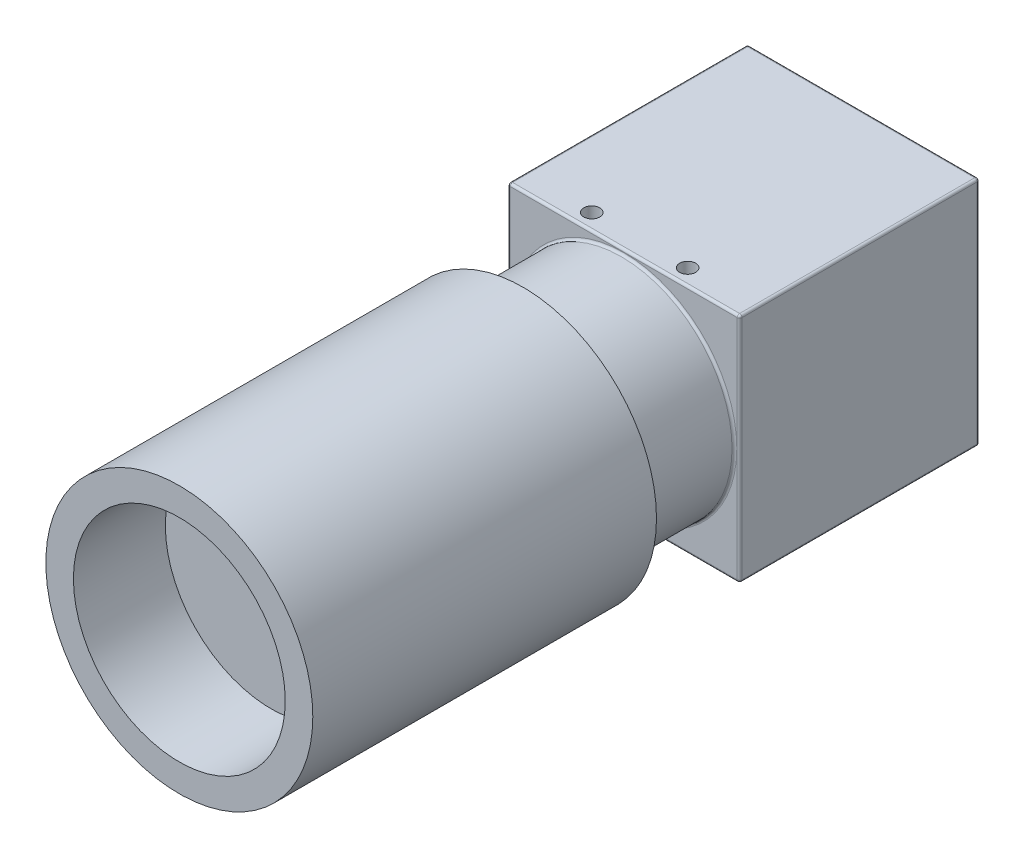
ISO-10303-21;
HEADER;
FILE_DESCRIPTION(('STEP AP214'),'2;1');
FILE_NAME('part.step','',(''),(''),'','','');
FILE_SCHEMA(('AUTOMOTIVE_DESIGN { 1 0 10303 214 1 1 1 1 }'));
ENDSEC;
DATA;
#1=APPLICATION_CONTEXT('core data for automotive mechanical design processes');
#2=APPLICATION_PROTOCOL_DEFINITION('international standard','automotive_design',2000,#1);
#3=PRODUCT_CONTEXT('',#1,'mechanical');
#4=PRODUCT('Part','Part','',(#3));
#5=PRODUCT_RELATED_PRODUCT_CATEGORY('part','',(#4));
#6=PRODUCT_DEFINITION_FORMATION('','',#4);
#7=PRODUCT_DEFINITION_CONTEXT('part definition',#1,'design');
#8=PRODUCT_DEFINITION('design','',#6,#7);
#9=PRODUCT_DEFINITION_SHAPE('','',#8);
#10=(LENGTH_UNIT() NAMED_UNIT(*) SI_UNIT(.MILLI.,.METRE.));
#11=(NAMED_UNIT(*) PLANE_ANGLE_UNIT() SI_UNIT($,.RADIAN.));
#12=(NAMED_UNIT(*) SI_UNIT($,.STERADIAN.) SOLID_ANGLE_UNIT());
#13=UNCERTAINTY_MEASURE_WITH_UNIT(LENGTH_MEASURE(1.E-05),#10,'distance_accuracy_value','');
#14=(GEOMETRIC_REPRESENTATION_CONTEXT(3) GLOBAL_UNCERTAINTY_ASSIGNED_CONTEXT((#13)) GLOBAL_UNIT_ASSIGNED_CONTEXT((#10,
#11,#12)) REPRESENTATION_CONTEXT('',''));
#15=CARTESIAN_POINT('',(0.,0.,0.));
#16=DIRECTION('',(0.,0.,1.));
#17=DIRECTION('',(1.,0.,0.));
#18=AXIS2_PLACEMENT_3D('',#15,#16,#17);
#19=CARTESIAN_POINT('',(0.,0.,30.));
#20=DIRECTION('',(1.,0.,0.));
#21=DIRECTION('',(0.,1.,0.));
#22=AXIS2_PLACEMENT_3D('',#19,#20,#21);
#23=PLANE('',#22);
#24=DIRECTION('',(0.,0.,-1.));
#25=VECTOR('',#24,1.);
#26=CARTESIAN_POINT('',(0.,28.7,30.));
#27=LINE('',#26,#25);
#28=CARTESIAN_POINT('',(0.,28.7,29.7));
#29=VERTEX_POINT('',#28);
#30=CARTESIAN_POINT('',(0.,28.7,0.300000000000002));
#31=VERTEX_POINT('',#30);
#32=EDGE_CURVE('E199',#29,#31,#27,.T.);
#33=ORIENTED_EDGE('',*,*,#32,.T.);
#34=DIRECTION('',(0.,-1.,0.));
#35=VECTOR('',#34,1.);
#36=CARTESIAN_POINT('',(0.,0.,0.300000000000002));
#37=LINE('',#36,#35);
#38=CARTESIAN_POINT('',(0.,0.3,0.300000000000002));
#39=VERTEX_POINT('',#38);
#40=EDGE_CURVE('E205',#31,#39,#37,.T.);
#41=ORIENTED_EDGE('',*,*,#40,.T.);
#42=DIRECTION('',(0.,0.,-1.));
#43=VECTOR('',#42,1.);
#44=CARTESIAN_POINT('',(0.,0.3,30.));
#45=LINE('',#44,#43);
#46=CARTESIAN_POINT('',(0.,0.3,29.7));
#47=VERTEX_POINT('',#46);
#48=EDGE_CURVE('E203',#39,#47,#45,.F.);
#49=ORIENTED_EDGE('',*,*,#48,.T.);
#50=DIRECTION('',(0.,-1.,0.));
#51=VECTOR('',#50,1.);
#52=CARTESIAN_POINT('',(0.,0.,29.7));
#53=LINE('',#52,#51);
#54=EDGE_CURVE('E201',#47,#29,#53,.F.);
#55=ORIENTED_EDGE('',*,*,#54,.T.);
#56=EDGE_LOOP('',(#33,#41,#49,#55));
#57=FACE_BOUND('',#56,.T.);
#58=ADVANCED_FACE('F34',(#57),#23,.F.);
#59=CARTESIAN_POINT('',(0.,0.,30.));
#60=DIRECTION('',(0.,1.,0.));
#61=DIRECTION('',(0.,0.,1.));
#62=AXIS2_PLACEMENT_3D('',#59,#60,#61);
#63=PLANE('',#62);
#64=DIRECTION('',(0.,0.,-1.));
#65=VECTOR('',#64,1.);
#66=CARTESIAN_POINT('',(0.3,0.,30.));
#67=LINE('',#66,#65);
#68=CARTESIAN_POINT('',(0.3,0.,29.7));
#69=VERTEX_POINT('',#68);
#70=CARTESIAN_POINT('',(0.3,0.,0.300000000000002));
#71=VERTEX_POINT('',#70);
#72=EDGE_CURVE('E133',#69,#71,#67,.T.);
#73=ORIENTED_EDGE('',*,*,#72,.T.);
#74=DIRECTION('',(1.,0.,0.));
#75=VECTOR('',#74,1.);
#76=CARTESIAN_POINT('',(29.,0.,0.300000000000002));
#77=LINE('',#76,#75);
#78=CARTESIAN_POINT('',(28.7,0.,0.300000000000002));
#79=VERTEX_POINT('',#78);
#80=EDGE_CURVE('E170',#71,#79,#77,.T.);
#81=ORIENTED_EDGE('',*,*,#80,.T.);
#82=DIRECTION('',(0.,0.,-1.));
#83=VECTOR('',#82,1.);
#84=CARTESIAN_POINT('',(28.7,0.,30.));
#85=LINE('',#84,#83);
#86=CARTESIAN_POINT('',(28.7,0.,29.7));
#87=VERTEX_POINT('',#86);
#88=EDGE_CURVE('E136',#79,#87,#85,.F.);
#89=ORIENTED_EDGE('',*,*,#88,.T.);
#90=DIRECTION('',(1.,0.,0.));
#91=VECTOR('',#90,1.);
#92=CARTESIAN_POINT('',(0.,0.,29.7));
#93=LINE('',#92,#91);
#94=EDGE_CURVE('E127',#87,#69,#93,.F.);
#95=ORIENTED_EDGE('',*,*,#94,.T.);
#96=EDGE_LOOP('',(#73,#81,#89,#95));
#97=FACE_BOUND('',#96,.T.);
#98=CARTESIAN_POINT('',(8.49999999999999,0.,25.3));
#99=DIRECTION('',(0.,-1.,0.));
#100=DIRECTION('',(0.,0.,1.));
#101=AXIS2_PLACEMENT_3D('',#98,#99,#100);
#102=CIRCLE('',#101,1.);
#103=CARTESIAN_POINT('',(8.49999999999999,0.,26.3));
#104=VERTEX_POINT('',#103);
#105=EDGE_CURVE('E287',#104,#104,#102,.T.);
#106=ORIENTED_EDGE('',*,*,#105,.F.);
#107=EDGE_LOOP('',(#106));
#108=FACE_BOUND('',#107,.T.);
#109=CARTESIAN_POINT('',(8.49999999999999,0.,3.3));
#110=DIRECTION('',(0.,-1.,0.));
#111=DIRECTION('',(0.,0.,1.));
#112=AXIS2_PLACEMENT_3D('',#109,#110,#111);
#113=CIRCLE('',#112,1.);
#114=CARTESIAN_POINT('',(8.49999999999999,0.,4.3));
#115=VERTEX_POINT('',#114);
#116=EDGE_CURVE('E298',#115,#115,#113,.T.);
#117=ORIENTED_EDGE('',*,*,#116,.F.);
#118=EDGE_LOOP('',(#117));
#119=FACE_BOUND('',#118,.T.);
#120=CARTESIAN_POINT('',(20.5,0.,3.3));
#121=DIRECTION('',(0.,-1.,0.));
#122=DIRECTION('',(0.,0.,-1.));
#123=AXIS2_PLACEMENT_3D('',#120,#121,#122);
#124=CIRCLE('',#123,1.);
#125=CARTESIAN_POINT('',(20.5,0.,2.3));
#126=VERTEX_POINT('',#125);
#127=EDGE_CURVE('E292',#126,#126,#124,.T.);
#128=ORIENTED_EDGE('',*,*,#127,.F.);
#129=EDGE_LOOP('',(#128));
#130=FACE_BOUND('',#129,.T.);
#131=CARTESIAN_POINT('',(20.5,0.,25.3));
#132=DIRECTION('',(0.,-1.,0.));
#133=DIRECTION('',(0.,0.,-1.));
#134=AXIS2_PLACEMENT_3D('',#131,#132,#133);
#135=CIRCLE('',#134,1.);
#136=CARTESIAN_POINT('',(20.5,0.,24.3));
#137=VERTEX_POINT('',#136);
#138=EDGE_CURVE('E291',#137,#137,#135,.T.);
#139=ORIENTED_EDGE('',*,*,#138,.F.);
#140=EDGE_LOOP('',(#139));
#141=FACE_BOUND('',#140,.T.);
#142=CARTESIAN_POINT('',(14.5,0.,3.3));
#143=DIRECTION('',(0.,-1.,0.));
#144=DIRECTION('',(0.,0.,-1.));
#145=AXIS2_PLACEMENT_3D('',#142,#143,#144);
#146=CIRCLE('',#145,1.5);
#147=CARTESIAN_POINT('',(14.5,0.,1.8));
#148=VERTEX_POINT('',#147);
#149=EDGE_CURVE('E309',#148,#148,#146,.T.);
#150=ORIENTED_EDGE('',*,*,#149,.F.);
#151=EDGE_LOOP('',(#150));
#152=FACE_BOUND('',#151,.T.);
#153=CARTESIAN_POINT('',(24.5,0.,27.));
#154=DIRECTION('',(0.,-1.,0.));
#155=DIRECTION('',(0.,0.,-1.));
#156=AXIS2_PLACEMENT_3D('',#153,#154,#155);
#157=CIRCLE('',#156,1.5);
#158=CARTESIAN_POINT('',(24.5,0.,25.5));
#159=VERTEX_POINT('',#158);
#160=EDGE_CURVE('E321',#159,#159,#157,.T.);
#161=ORIENTED_EDGE('',*,*,#160,.F.);
#162=EDGE_LOOP('',(#161));
#163=FACE_BOUND('',#162,.T.);
#164=CARTESIAN_POINT('',(4.49999999999999,0.,27.));
#165=DIRECTION('',(0.,-1.,0.));
#166=DIRECTION('',(0.,0.,1.));
#167=AXIS2_PLACEMENT_3D('',#164,#165,#166);
#168=CIRCLE('',#167,1.5);
#169=CARTESIAN_POINT('',(4.49999999999999,0.,28.5));
#170=VERTEX_POINT('',#169);
#171=EDGE_CURVE('E315',#170,#170,#168,.T.);
#172=ORIENTED_EDGE('',*,*,#171,.F.);
#173=EDGE_LOOP('',(#172));
#174=FACE_BOUND('',#173,.T.);
#175=ADVANCED_FACE('F129',(#97,#108,#119,#130,#141,#152,#163,#174),#63,.F.);
#176=CARTESIAN_POINT('',(29.,0.,30.));
#177=DIRECTION('',(-1.,0.,0.));
#178=DIRECTION('',(0.,-1.,0.));
#179=AXIS2_PLACEMENT_3D('',#176,#177,#178);
#180=PLANE('',#179);
#181=DIRECTION('',(0.,0.,-1.));
#182=VECTOR('',#181,1.);
#183=CARTESIAN_POINT('',(29.,0.3,30.));
#184=LINE('',#183,#182);
#185=CARTESIAN_POINT('',(29.,0.3,29.7));
#186=VERTEX_POINT('',#185);
#187=CARTESIAN_POINT('',(29.,0.3,0.300000000000002));
#188=VERTEX_POINT('',#187);
#189=EDGE_CURVE('E185',#186,#188,#184,.T.);
#190=ORIENTED_EDGE('',*,*,#189,.T.);
#191=DIRECTION('',(0.,1.,0.));
#192=VECTOR('',#191,1.);
#193=CARTESIAN_POINT('',(29.,29.,0.300000000000002));
#194=LINE('',#193,#192);
#195=CARTESIAN_POINT('',(29.,28.7,0.300000000000002));
#196=VERTEX_POINT('',#195);
#197=EDGE_CURVE('E187',#188,#196,#194,.T.);
#198=ORIENTED_EDGE('',*,*,#197,.T.);
#199=DIRECTION('',(0.,0.,-1.));
#200=VECTOR('',#199,1.);
#201=CARTESIAN_POINT('',(29.,28.7,30.));
#202=LINE('',#201,#200);
#203=CARTESIAN_POINT('',(29.,28.7,29.7));
#204=VERTEX_POINT('',#203);
#205=EDGE_CURVE('E183',#196,#204,#202,.F.);
#206=ORIENTED_EDGE('',*,*,#205,.T.);
#207=DIRECTION('',(0.,1.,0.));
#208=VECTOR('',#207,1.);
#209=CARTESIAN_POINT('',(29.,0.,29.7));
#210=LINE('',#209,#208);
#211=EDGE_CURVE('E181',#204,#186,#210,.F.);
#212=ORIENTED_EDGE('',*,*,#211,.T.);
#213=EDGE_LOOP('',(#190,#198,#206,#212));
#214=FACE_BOUND('',#213,.T.);
#215=ADVANCED_FACE('F342',(#214),#180,.F.);
#216=CARTESIAN_POINT('',(0.,29.,30.));
#217=DIRECTION('',(0.,-1.,0.));
#218=DIRECTION('',(0.,0.,-1.));
#219=AXIS2_PLACEMENT_3D('',#216,#217,#218);
#220=PLANE('',#219);
#221=DIRECTION('',(0.,0.,-1.));
#222=VECTOR('',#221,1.);
#223=CARTESIAN_POINT('',(28.7,29.,30.));
#224=LINE('',#223,#222);
#225=CARTESIAN_POINT('',(28.7,29.,29.7));
#226=VERTEX_POINT('',#225);
#227=CARTESIAN_POINT('',(28.7,29.,0.300000000000002));
#228=VERTEX_POINT('',#227);
#229=EDGE_CURVE('E194',#226,#228,#224,.T.);
#230=ORIENTED_EDGE('',*,*,#229,.T.);
#231=DIRECTION('',(-1.,0.,0.));
#232=VECTOR('',#231,1.);
#233=CARTESIAN_POINT('',(0.,29.,0.300000000000002));
#234=LINE('',#233,#232);
#235=CARTESIAN_POINT('',(0.299999999999996,29.,0.300000000000002));
#236=VERTEX_POINT('',#235);
#237=EDGE_CURVE('E196',#228,#236,#234,.T.);
#238=ORIENTED_EDGE('',*,*,#237,.T.);
#239=DIRECTION('',(0.,0.,-1.));
#240=VECTOR('',#239,1.);
#241=CARTESIAN_POINT('',(0.299999999999996,29.,30.));
#242=LINE('',#241,#240);
#243=CARTESIAN_POINT('',(0.299999999999996,29.,29.7));
#244=VERTEX_POINT('',#243);
#245=EDGE_CURVE('E192',#236,#244,#242,.F.);
#246=ORIENTED_EDGE('',*,*,#245,.T.);
#247=DIRECTION('',(-1.,0.,0.));
#248=VECTOR('',#247,1.);
#249=CARTESIAN_POINT('',(0.,29.,29.7));
#250=LINE('',#249,#248);
#251=EDGE_CURVE('E190',#244,#226,#250,.F.);
#252=ORIENTED_EDGE('',*,*,#251,.T.);
#253=EDGE_LOOP('',(#230,#238,#246,#252));
#254=FACE_BOUND('',#253,.T.);
#255=CARTESIAN_POINT('',(8.5,29.,28.));
#256=DIRECTION('',(0.,1.,0.));
#257=DIRECTION('',(0.,0.,1.));
#258=AXIS2_PLACEMENT_3D('',#255,#256,#257);
#259=CIRCLE('',#258,1.);
#260=CARTESIAN_POINT('',(8.5,29.,29.));
#261=VERTEX_POINT('',#260);
#262=EDGE_CURVE('E163',#261,#261,#259,.T.);
#263=ORIENTED_EDGE('',*,*,#262,.F.);
#264=EDGE_LOOP('',(#263));
#265=FACE_BOUND('',#264,.T.);
#266=CARTESIAN_POINT('',(20.5,29.,28.));
#267=DIRECTION('',(0.,1.,0.));
#268=DIRECTION('',(0.,0.,-1.));
#269=AXIS2_PLACEMENT_3D('',#266,#267,#268);
#270=CIRCLE('',#269,1.);
#271=CARTESIAN_POINT('',(20.5,29.,27.));
#272=VERTEX_POINT('',#271);
#273=EDGE_CURVE('E166',#272,#272,#270,.T.);
#274=ORIENTED_EDGE('',*,*,#273,.F.);
#275=EDGE_LOOP('',(#274));
#276=FACE_BOUND('',#275,.T.);
#277=ADVANCED_FACE('F339',(#254,#265,#276),#220,.F.);
#278=CARTESIAN_POINT('',(0.,0.,30.));
#279=DIRECTION('',(0.,0.,-1.));
#280=DIRECTION('',(-1.,0.,0.));
#281=AXIS2_PLACEMENT_3D('',#278,#279,#280);
#282=PLANE('',#281);
#283=DIRECTION('',(0.,-1.,0.));
#284=VECTOR('',#283,1.);
#285=CARTESIAN_POINT('',(0.3,0.,30.));
#286=LINE('',#285,#284);
#287=CARTESIAN_POINT('',(0.299999999999996,28.7,30.));
#288=VERTEX_POINT('',#287);
#289=CARTESIAN_POINT('',(0.3,0.3,30.));
#290=VERTEX_POINT('',#289);
#291=EDGE_CURVE('E59',#288,#290,#286,.T.);
#292=ORIENTED_EDGE('',*,*,#291,.T.);
#293=DIRECTION('',(1.,0.,0.));
#294=VECTOR('',#293,1.);
#295=CARTESIAN_POINT('',(0.,0.3,30.));
#296=LINE('',#295,#294);
#297=CARTESIAN_POINT('',(28.7,0.3,30.));
#298=VERTEX_POINT('',#297);
#299=EDGE_CURVE('E43',#290,#298,#296,.T.);
#300=ORIENTED_EDGE('',*,*,#299,.T.);
#301=DIRECTION('',(0.,1.,0.));
#302=VECTOR('',#301,1.);
#303=CARTESIAN_POINT('',(28.7,0.,30.));
#304=LINE('',#303,#302);
#305=CARTESIAN_POINT('',(28.7,28.7,30.));
#306=VERTEX_POINT('',#305);
#307=EDGE_CURVE('E214',#298,#306,#304,.T.);
#308=ORIENTED_EDGE('',*,*,#307,.T.);
#309=DIRECTION('',(-1.,0.,0.));
#310=VECTOR('',#309,1.);
#311=CARTESIAN_POINT('',(0.,28.7,30.));
#312=LINE('',#311,#310);
#313=EDGE_CURVE('E211',#306,#288,#312,.T.);
#314=ORIENTED_EDGE('',*,*,#313,.T.);
#315=EDGE_LOOP('',(#292,#300,#308,#314));
#316=FACE_BOUND('',#315,.T.);
#317=CARTESIAN_POINT('',(14.5,14.5,30.));
#318=DIRECTION('',(0.,0.,-1.));
#319=DIRECTION('',(-1.,0.,0.));
#320=AXIS2_PLACEMENT_3D('',#317,#318,#319);
#321=CIRCLE('',#320,14.15);
#322=CARTESIAN_POINT('',(0.349999999999998,14.5,30.));
#323=VERTEX_POINT('',#322);
#324=EDGE_CURVE('E208',#323,#323,#321,.T.);
#325=ORIENTED_EDGE('',*,*,#324,.T.);
#326=EDGE_LOOP('',(#325));
#327=FACE_BOUND('',#326,.T.);
#328=ADVANCED_FACE('F341',(#316,#327),#282,.F.);
#329=CARTESIAN_POINT('',(0.,0.,0.));
#330=DIRECTION('',(0.,0.,-1.));
#331=DIRECTION('',(-1.,0.,0.));
#332=AXIS2_PLACEMENT_3D('',#329,#330,#331);
#333=PLANE('',#332);
#334=DIRECTION('',(0.,1.,0.));
#335=VECTOR('',#334,1.);
#336=CARTESIAN_POINT('',(28.7,0.,0.));
#337=LINE('',#336,#335);
#338=CARTESIAN_POINT('',(28.7,28.7,0.));
#339=VERTEX_POINT('',#338);
#340=CARTESIAN_POINT('',(28.7,0.3,0.));
#341=VERTEX_POINT('',#340);
#342=EDGE_CURVE('E176',#339,#341,#337,.F.);
#343=ORIENTED_EDGE('',*,*,#342,.T.);
#344=DIRECTION('',(1.,0.,0.));
#345=VECTOR('',#344,1.);
#346=CARTESIAN_POINT('',(0.,0.3,0.));
#347=LINE('',#346,#345);
#348=CARTESIAN_POINT('',(0.3,0.3,0.));
#349=VERTEX_POINT('',#348);
#350=EDGE_CURVE('E178',#341,#349,#347,.F.);
#351=ORIENTED_EDGE('',*,*,#350,.T.);
#352=DIRECTION('',(0.,-1.,0.));
#353=VECTOR('',#352,1.);
#354=CARTESIAN_POINT('',(0.299999999999996,29.,0.));
#355=LINE('',#354,#353);
#356=CARTESIAN_POINT('',(0.299999999999996,28.7,0.));
#357=VERTEX_POINT('',#356);
#358=EDGE_CURVE('E172',#349,#357,#355,.F.);
#359=ORIENTED_EDGE('',*,*,#358,.T.);
#360=DIRECTION('',(-1.,0.,0.));
#361=VECTOR('',#360,1.);
#362=CARTESIAN_POINT('',(29.,28.7,0.));
#363=LINE('',#362,#361);
#364=EDGE_CURVE('E174',#357,#339,#363,.F.);
#365=ORIENTED_EDGE('',*,*,#364,.T.);
#366=EDGE_LOOP('',(#343,#351,#359,#365));
#367=FACE_BOUND('',#366,.T.);
#368=ADVANCED_FACE('F349',(#367),#333,.T.);
#369=CARTESIAN_POINT('',(20.5,26.5,28.));
#370=DIRECTION('',(0.,1.,0.));
#371=DIRECTION('',(0.,0.,1.));
#372=AXIS2_PLACEMENT_3D('',#369,#370,#371);
#373=CYLINDRICAL_SURFACE('',#372,1.);
#374=CARTESIAN_POINT('',(20.5,26.5,28.));
#375=DIRECTION('',(0.,1.,0.));
#376=DIRECTION('',(0.,0.,-1.));
#377=AXIS2_PLACEMENT_3D('',#374,#375,#376);
#378=CIRCLE('',#377,1.);
#379=CARTESIAN_POINT('',(20.5,26.5,27.));
#380=VERTEX_POINT('',#379);
#381=EDGE_CURVE('E330',#380,#380,#378,.T.);
#382=ORIENTED_EDGE('',*,*,#381,.F.);
#383=EDGE_LOOP('',(#382));
#384=FACE_BOUND('',#383,.T.);
#385=ORIENTED_EDGE('',*,*,#273,.T.);
#386=EDGE_LOOP('',(#385));
#387=FACE_BOUND('',#386,.T.);
#388=ADVANCED_FACE('F337',(#384,#387),#373,.F.);
#389=CARTESIAN_POINT('',(20.5,26.5,28.));
#390=DIRECTION('',(0.,-1.,0.));
#391=DIRECTION('',(0.,0.,-1.));
#392=AXIS2_PLACEMENT_3D('',#389,#390,#391);
#393=PLANE('',#392);
#394=ORIENTED_EDGE('',*,*,#381,.T.);
#395=EDGE_LOOP('',(#394));
#396=FACE_BOUND('',#395,.T.);
#397=ADVANCED_FACE('F540',(#396),#393,.F.);
#398=CARTESIAN_POINT('',(8.5,26.5,28.));
#399=DIRECTION('',(0.,1.,0.));
#400=DIRECTION('',(0.,0.,1.));
#401=AXIS2_PLACEMENT_3D('',#398,#399,#400);
#402=CYLINDRICAL_SURFACE('',#401,1.);
#403=CARTESIAN_POINT('',(8.5,26.5,28.));
#404=DIRECTION('',(0.,1.,0.));
#405=DIRECTION('',(0.,0.,1.));
#406=AXIS2_PLACEMENT_3D('',#403,#404,#405);
#407=CIRCLE('',#406,1.);
#408=CARTESIAN_POINT('',(8.5,26.5,29.));
#409=VERTEX_POINT('',#408);
#410=EDGE_CURVE('E160',#409,#409,#407,.T.);
#411=ORIENTED_EDGE('',*,*,#410,.F.);
#412=EDGE_LOOP('',(#411));
#413=FACE_BOUND('',#412,.T.);
#414=ORIENTED_EDGE('',*,*,#262,.T.);
#415=EDGE_LOOP('',(#414));
#416=FACE_BOUND('',#415,.T.);
#417=ADVANCED_FACE('F536',(#413,#416),#402,.F.);
#418=CARTESIAN_POINT('',(8.5,26.5,28.));
#419=DIRECTION('',(0.,1.,0.));
#420=DIRECTION('',(0.,0.,1.));
#421=AXIS2_PLACEMENT_3D('',#418,#419,#420);
#422=PLANE('',#421);
#423=ORIENTED_EDGE('',*,*,#410,.T.);
#424=EDGE_LOOP('',(#423));
#425=FACE_BOUND('',#424,.T.);
#426=ADVANCED_FACE('F532',(#425),#422,.T.);
#427=CARTESIAN_POINT('',(4.49999999999999,2.8,27.));
#428=DIRECTION('',(0.,-1.,0.));
#429=DIRECTION('',(0.,0.,-1.));
#430=AXIS2_PLACEMENT_3D('',#427,#428,#429);
#431=CYLINDRICAL_SURFACE('',#430,1.5);
#432=CARTESIAN_POINT('',(4.49999999999999,2.8,27.));
#433=DIRECTION('',(0.,-1.,0.));
#434=DIRECTION('',(0.,0.,1.));
#435=AXIS2_PLACEMENT_3D('',#432,#433,#434);
#436=CIRCLE('',#435,1.5);
#437=CARTESIAN_POINT('',(4.49999999999999,2.8,28.5));
#438=VERTEX_POINT('',#437);
#439=EDGE_CURVE('E324',#438,#438,#436,.T.);
#440=ORIENTED_EDGE('',*,*,#439,.F.);
#441=EDGE_LOOP('',(#440));
#442=FACE_BOUND('',#441,.T.);
#443=ORIENTED_EDGE('',*,*,#171,.T.);
#444=EDGE_LOOP('',(#443));
#445=FACE_BOUND('',#444,.T.);
#446=ADVANCED_FACE('F528',(#442,#445),#431,.F.);
#447=CARTESIAN_POINT('',(4.49999999999999,2.8,27.));
#448=DIRECTION('',(0.,1.,0.));
#449=DIRECTION('',(0.,0.,1.));
#450=AXIS2_PLACEMENT_3D('',#447,#448,#449);
#451=PLANE('',#450);
#452=ORIENTED_EDGE('',*,*,#439,.T.);
#453=EDGE_LOOP('',(#452));
#454=FACE_BOUND('',#453,.T.);
#455=ADVANCED_FACE('F524',(#454),#451,.F.);
#456=CARTESIAN_POINT('',(24.5,2.8,27.));
#457=DIRECTION('',(0.,-1.,0.));
#458=DIRECTION('',(0.,0.,-1.));
#459=AXIS2_PLACEMENT_3D('',#456,#457,#458);
#460=CYLINDRICAL_SURFACE('',#459,1.5);
#461=CARTESIAN_POINT('',(24.5,2.8,27.));
#462=DIRECTION('',(0.,-1.,0.));
#463=DIRECTION('',(0.,0.,-1.));
#464=AXIS2_PLACEMENT_3D('',#461,#462,#463);
#465=CIRCLE('',#464,1.5);
#466=CARTESIAN_POINT('',(24.5,2.8,25.5));
#467=VERTEX_POINT('',#466);
#468=EDGE_CURVE('E318',#467,#467,#465,.T.);
#469=ORIENTED_EDGE('',*,*,#468,.F.);
#470=EDGE_LOOP('',(#469));
#471=FACE_BOUND('',#470,.T.);
#472=ORIENTED_EDGE('',*,*,#160,.T.);
#473=EDGE_LOOP('',(#472));
#474=FACE_BOUND('',#473,.T.);
#475=ADVANCED_FACE('F520',(#471,#474),#460,.F.);
#476=CARTESIAN_POINT('',(24.5,2.8,27.));
#477=DIRECTION('',(0.,-1.,0.));
#478=DIRECTION('',(0.,0.,-1.));
#479=AXIS2_PLACEMENT_3D('',#476,#477,#478);
#480=PLANE('',#479);
#481=ORIENTED_EDGE('',*,*,#468,.T.);
#482=EDGE_LOOP('',(#481));
#483=FACE_BOUND('',#482,.T.);
#484=ADVANCED_FACE('F516',(#483),#480,.T.);
#485=CARTESIAN_POINT('',(14.5,2.5,3.3));
#486=DIRECTION('',(0.,-1.,0.));
#487=DIRECTION('',(0.,0.,-1.));
#488=AXIS2_PLACEMENT_3D('',#485,#486,#487);
#489=CYLINDRICAL_SURFACE('',#488,1.5);
#490=CARTESIAN_POINT('',(14.5,2.5,3.3));
#491=DIRECTION('',(0.,-1.,0.));
#492=DIRECTION('',(0.,0.,-1.));
#493=AXIS2_PLACEMENT_3D('',#490,#491,#492);
#494=CIRCLE('',#493,1.5);
#495=CARTESIAN_POINT('',(14.5,2.5,1.8));
#496=VERTEX_POINT('',#495);
#497=EDGE_CURVE('E312',#496,#496,#494,.T.);
#498=ORIENTED_EDGE('',*,*,#497,.F.);
#499=EDGE_LOOP('',(#498));
#500=FACE_BOUND('',#499,.T.);
#501=ORIENTED_EDGE('',*,*,#149,.T.);
#502=EDGE_LOOP('',(#501));
#503=FACE_BOUND('',#502,.T.);
#504=ADVANCED_FACE('F512',(#500,#503),#489,.F.);
#505=CARTESIAN_POINT('',(14.5,2.5,3.3));
#506=DIRECTION('',(0.,-1.,0.));
#507=DIRECTION('',(0.,0.,-1.));
#508=AXIS2_PLACEMENT_3D('',#505,#506,#507);
#509=PLANE('',#508);
#510=ORIENTED_EDGE('',*,*,#497,.T.);
#511=EDGE_LOOP('',(#510));
#512=FACE_BOUND('',#511,.T.);
#513=ADVANCED_FACE('F508',(#512),#509,.T.);
#514=CARTESIAN_POINT('',(20.5,2.,25.3));
#515=DIRECTION('',(0.,-1.,0.));
#516=DIRECTION('',(0.,0.,-1.));
#517=AXIS2_PLACEMENT_3D('',#514,#515,#516);
#518=CYLINDRICAL_SURFACE('',#517,1.);
#519=CARTESIAN_POINT('',(20.5,2.,25.3));
#520=DIRECTION('',(0.,-1.,0.));
#521=DIRECTION('',(0.,0.,-1.));
#522=AXIS2_PLACEMENT_3D('',#519,#520,#521);
#523=CIRCLE('',#522,1.);
#524=CARTESIAN_POINT('',(20.5,2.,24.3));
#525=VERTEX_POINT('',#524);
#526=EDGE_CURVE('E306',#525,#525,#523,.T.);
#527=ORIENTED_EDGE('',*,*,#526,.F.);
#528=EDGE_LOOP('',(#527));
#529=FACE_BOUND('',#528,.T.);
#530=ORIENTED_EDGE('',*,*,#138,.T.);
#531=EDGE_LOOP('',(#530));
#532=FACE_BOUND('',#531,.T.);
#533=ADVANCED_FACE('F504',(#529,#532),#518,.F.);
#534=CARTESIAN_POINT('',(20.5,2.,25.3));
#535=DIRECTION('',(0.,-1.,0.));
#536=DIRECTION('',(0.,0.,-1.));
#537=AXIS2_PLACEMENT_3D('',#534,#535,#536);
#538=PLANE('',#537);
#539=ORIENTED_EDGE('',*,*,#526,.T.);
#540=EDGE_LOOP('',(#539));
#541=FACE_BOUND('',#540,.T.);
#542=ADVANCED_FACE('F490',(#541),#538,.T.);
#543=CARTESIAN_POINT('',(20.5,2.,3.3));
#544=DIRECTION('',(0.,-1.,0.));
#545=DIRECTION('',(0.,0.,-1.));
#546=AXIS2_PLACEMENT_3D('',#543,#544,#545);
#547=CYLINDRICAL_SURFACE('',#546,1.);
#548=CARTESIAN_POINT('',(20.5,2.,3.3));
#549=DIRECTION('',(0.,-1.,0.));
#550=DIRECTION('',(0.,0.,-1.));
#551=AXIS2_PLACEMENT_3D('',#548,#549,#550);
#552=CIRCLE('',#551,1.);
#553=CARTESIAN_POINT('',(20.5,2.,2.3));
#554=VERTEX_POINT('',#553);
#555=EDGE_CURVE('E288',#554,#554,#552,.T.);
#556=ORIENTED_EDGE('',*,*,#555,.F.);
#557=EDGE_LOOP('',(#556));
#558=FACE_BOUND('',#557,.T.);
#559=ORIENTED_EDGE('',*,*,#127,.T.);
#560=EDGE_LOOP('',(#559));
#561=FACE_BOUND('',#560,.T.);
#562=ADVANCED_FACE('F486',(#558,#561),#547,.F.);
#563=CARTESIAN_POINT('',(20.5,2.,3.3));
#564=DIRECTION('',(0.,-1.,0.));
#565=DIRECTION('',(0.,0.,-1.));
#566=AXIS2_PLACEMENT_3D('',#563,#564,#565);
#567=PLANE('',#566);
#568=ORIENTED_EDGE('',*,*,#555,.T.);
#569=EDGE_LOOP('',(#568));
#570=FACE_BOUND('',#569,.T.);
#571=ADVANCED_FACE('F482',(#570),#567,.T.);
#572=CARTESIAN_POINT('',(8.49999999999999,2.,3.3));
#573=DIRECTION('',(0.,-1.,0.));
#574=DIRECTION('',(0.,0.,-1.));
#575=AXIS2_PLACEMENT_3D('',#572,#573,#574);
#576=CYLINDRICAL_SURFACE('',#575,1.);
#577=CARTESIAN_POINT('',(8.49999999999999,2.,3.3));
#578=DIRECTION('',(0.,-1.,0.));
#579=DIRECTION('',(0.,0.,1.));
#580=AXIS2_PLACEMENT_3D('',#577,#578,#579);
#581=CIRCLE('',#580,1.);
#582=CARTESIAN_POINT('',(8.49999999999999,2.,4.3));
#583=VERTEX_POINT('',#582);
#584=EDGE_CURVE('E295',#583,#583,#581,.T.);
#585=ORIENTED_EDGE('',*,*,#584,.F.);
#586=EDGE_LOOP('',(#585));
#587=FACE_BOUND('',#586,.T.);
#588=ORIENTED_EDGE('',*,*,#116,.T.);
#589=EDGE_LOOP('',(#588));
#590=FACE_BOUND('',#589,.T.);
#591=ADVANCED_FACE('F485',(#587,#590),#576,.F.);
#592=CARTESIAN_POINT('',(8.49999999999999,2.,3.3));
#593=DIRECTION('',(0.,1.,0.));
#594=DIRECTION('',(0.,0.,1.));
#595=AXIS2_PLACEMENT_3D('',#592,#593,#594);
#596=PLANE('',#595);
#597=ORIENTED_EDGE('',*,*,#584,.T.);
#598=EDGE_LOOP('',(#597));
#599=FACE_BOUND('',#598,.T.);
#600=ADVANCED_FACE('F492',(#599),#596,.F.);
#601=CARTESIAN_POINT('',(8.49999999999999,2.,25.3));
#602=DIRECTION('',(0.,-1.,0.));
#603=DIRECTION('',(0.,0.,-1.));
#604=AXIS2_PLACEMENT_3D('',#601,#602,#603);
#605=CYLINDRICAL_SURFACE('',#604,1.);
#606=CARTESIAN_POINT('',(8.49999999999999,2.,25.3));
#607=DIRECTION('',(0.,-1.,0.));
#608=DIRECTION('',(0.,0.,1.));
#609=AXIS2_PLACEMENT_3D('',#606,#607,#608);
#610=CIRCLE('',#609,1.);
#611=CARTESIAN_POINT('',(8.49999999999999,2.,26.3));
#612=VERTEX_POINT('',#611);
#613=EDGE_CURVE('E301',#612,#612,#610,.T.);
#614=ORIENTED_EDGE('',*,*,#613,.F.);
#615=EDGE_LOOP('',(#614));
#616=FACE_BOUND('',#615,.T.);
#617=ORIENTED_EDGE('',*,*,#105,.T.);
#618=EDGE_LOOP('',(#617));
#619=FACE_BOUND('',#618,.T.);
#620=ADVANCED_FACE('F478',(#616,#619),#605,.F.);
#621=CARTESIAN_POINT('',(8.49999999999999,2.,25.3));
#622=DIRECTION('',(0.,1.,0.));
#623=DIRECTION('',(0.,0.,1.));
#624=AXIS2_PLACEMENT_3D('',#621,#622,#623);
#625=PLANE('',#624);
#626=ORIENTED_EDGE('',*,*,#613,.T.);
#627=EDGE_LOOP('',(#626));
#628=FACE_BOUND('',#627,.T.);
#629=ADVANCED_FACE('F468',(#628),#625,.F.);
#630=CARTESIAN_POINT('',(14.5,14.5,42.6));
#631=DIRECTION('',(0.,0.,-1.));
#632=DIRECTION('',(-1.,0.,0.));
#633=AXIS2_PLACEMENT_3D('',#630,#631,#632);
#634=CYLINDRICAL_SURFACE('',#633,13.85);
#635=CARTESIAN_POINT('',(14.5,14.5,30.3));
#636=DIRECTION('',(0.,0.,-1.));
#637=DIRECTION('',(-1.,0.,0.));
#638=AXIS2_PLACEMENT_3D('',#635,#636,#637);
#639=CIRCLE('',#638,13.85);
#640=CARTESIAN_POINT('',(0.649999999999998,14.5,30.3));
#641=VERTEX_POINT('',#640);
#642=EDGE_CURVE('E11',#641,#641,#639,.F.);
#643=ORIENTED_EDGE('',*,*,#642,.T.);
#644=EDGE_LOOP('',(#643));
#645=FACE_BOUND('',#644,.T.);
#646=CARTESIAN_POINT('',(14.5,14.5,42.6));
#647=DIRECTION('',(0.,0.,1.));
#648=DIRECTION('',(1.,0.,0.));
#649=AXIS2_PLACEMENT_3D('',#646,#647,#648);
#650=CIRCLE('',#649,13.85);
#651=CARTESIAN_POINT('',(28.35,14.5,42.6));
#652=VERTEX_POINT('',#651);
#653=EDGE_CURVE('E281',#652,#652,#650,.T.);
#654=ORIENTED_EDGE('',*,*,#653,.F.);
#655=EDGE_LOOP('',(#654));
#656=FACE_BOUND('',#655,.T.);
#657=ADVANCED_FACE('F464',(#645,#656),#634,.T.);
#658=CARTESIAN_POINT('',(14.5,14.5,85.6));
#659=DIRECTION('',(0.,0.,-1.));
#660=DIRECTION('',(-1.,0.,0.));
#661=AXIS2_PLACEMENT_3D('',#658,#659,#660);
#662=CYLINDRICAL_SURFACE('',#661,16.7);
#663=CARTESIAN_POINT('',(14.5,14.5,85.6));
#664=DIRECTION('',(0.,0.,1.));
#665=DIRECTION('',(1.,0.,0.));
#666=AXIS2_PLACEMENT_3D('',#663,#664,#665);
#667=CIRCLE('',#666,16.7);
#668=CARTESIAN_POINT('',(31.2,14.5,85.6));
#669=VERTEX_POINT('',#668);
#670=EDGE_CURVE('E276',#669,#669,#667,.T.);
#671=ORIENTED_EDGE('',*,*,#670,.F.);
#672=EDGE_LOOP('',(#671));
#673=FACE_BOUND('',#672,.T.);
#674=CARTESIAN_POINT('',(14.5,14.5,42.6));
#675=DIRECTION('',(0.,0.,1.));
#676=DIRECTION('',(1.,0.,0.));
#677=AXIS2_PLACEMENT_3D('',#674,#675,#676);
#678=CIRCLE('',#677,16.7);
#679=CARTESIAN_POINT('',(31.2,14.5,42.6));
#680=VERTEX_POINT('',#679);
#681=EDGE_CURVE('E270',#680,#680,#678,.T.);
#682=ORIENTED_EDGE('',*,*,#681,.T.);
#683=EDGE_LOOP('',(#682));
#684=FACE_BOUND('',#683,.T.);
#685=ADVANCED_FACE('F467',(#673,#684),#662,.T.);
#686=CARTESIAN_POINT('',(14.5,14.5,85.6));
#687=DIRECTION('',(0.,0.,1.));
#688=DIRECTION('',(1.,0.,0.));
#689=AXIS2_PLACEMENT_3D('',#686,#687,#688);
#690=PLANE('',#689);
#691=CARTESIAN_POINT('',(14.5,14.5,85.6));
#692=DIRECTION('',(0.,0.,1.));
#693=DIRECTION('',(1.,0.,0.));
#694=AXIS2_PLACEMENT_3D('',#691,#692,#693);
#695=CIRCLE('',#694,13.25);
#696=CARTESIAN_POINT('',(27.75,14.5,85.6));
#697=VERTEX_POINT('',#696);
#698=EDGE_CURVE('E747',#697,#697,#695,.T.);
#699=ORIENTED_EDGE('',*,*,#698,.F.);
#700=EDGE_LOOP('',(#699));
#701=FACE_BOUND('',#700,.T.);
#702=ORIENTED_EDGE('',*,*,#670,.T.);
#703=EDGE_LOOP('',(#702));
#704=FACE_BOUND('',#703,.T.);
#705=ADVANCED_FACE('F436',(#701,#704),#690,.T.);
#706=CARTESIAN_POINT('',(14.5,14.5,42.6));
#707=DIRECTION('',(0.,0.,1.));
#708=DIRECTION('',(1.,0.,0.));
#709=AXIS2_PLACEMENT_3D('',#706,#707,#708);
#710=PLANE('',#709);
#711=ORIENTED_EDGE('',*,*,#653,.T.);
#712=EDGE_LOOP('',(#711));
#713=FACE_BOUND('',#712,.T.);
#714=ORIENTED_EDGE('',*,*,#681,.F.);
#715=EDGE_LOOP('',(#714));
#716=FACE_BOUND('',#715,.T.);
#717=ADVANCED_FACE('F431',(#713,#716),#710,.F.);
#718=CARTESIAN_POINT('',(0.,28.7,29.7));
#719=DIRECTION('',(-1.,0.,0.));
#720=DIRECTION('',(0.,0.,1.));
#721=AXIS2_PLACEMENT_3D('',#718,#719,#720);
#722=CYLINDRICAL_SURFACE('',#721,0.3);
#723=CARTESIAN_POINT('',(0.299999999999996,28.7,29.7));
#724=DIRECTION('',(-1.,0.,0.));
#725=DIRECTION('',(0.,0.,1.));
#726=AXIS2_PLACEMENT_3D('',#723,#724,#725);
#727=CIRCLE('',#726,0.3);
#728=EDGE_CURVE('E38',#288,#244,#727,.T.);
#729=ORIENTED_EDGE('',*,*,#728,.F.);
#730=ORIENTED_EDGE('',*,*,#313,.F.);
#731=CARTESIAN_POINT('',(28.7,28.7,29.7));
#732=DIRECTION('',(1.,0.,0.));
#733=DIRECTION('',(0.,0.,-1.));
#734=AXIS2_PLACEMENT_3D('',#731,#732,#733);
#735=CIRCLE('',#734,0.3);
#736=EDGE_CURVE('E263',#226,#306,#735,.T.);
#737=ORIENTED_EDGE('',*,*,#736,.F.);
#738=ORIENTED_EDGE('',*,*,#251,.F.);
#739=EDGE_LOOP('',(#729,#730,#737,#738));
#740=FACE_BOUND('',#739,.T.);
#741=ADVANCED_FACE('F429',(#740),#722,.T.);
#742=CARTESIAN_POINT('',(0.299999999999996,28.7,29.7));
#743=DIRECTION('',(0.,0.,1.));
#744=DIRECTION('',(1.,0.,0.));
#745=AXIS2_PLACEMENT_3D('',#742,#743,#744);
#746=SPHERICAL_SURFACE('',#745,0.3);
#747=CARTESIAN_POINT('',(0.299999999999997,28.7,29.7));
#748=DIRECTION('',(0.,1.,0.));
#749=DIRECTION('',(0.,0.,1.));
#750=AXIS2_PLACEMENT_3D('',#747,#748,#749);
#751=CIRCLE('',#750,0.3);
#752=EDGE_CURVE('E258',#288,#29,#751,.F.);
#753=ORIENTED_EDGE('',*,*,#752,.F.);
#754=ORIENTED_EDGE('',*,*,#728,.T.);
#755=CARTESIAN_POINT('',(0.299999999999996,28.7,29.7));
#756=DIRECTION('',(0.,0.,1.));
#757=DIRECTION('',(1.,0.,0.));
#758=AXIS2_PLACEMENT_3D('',#755,#756,#757);
#759=CIRCLE('',#758,0.3);
#760=EDGE_CURVE('E261',#29,#244,#759,.F.);
#761=ORIENTED_EDGE('',*,*,#760,.F.);
#762=EDGE_LOOP('',(#753,#754,#761));
#763=FACE_BOUND('',#762,.T.);
#764=ADVANCED_FACE('F427',(#763),#746,.T.);
#765=CARTESIAN_POINT('',(28.7,28.7,29.7));
#766=DIRECTION('',(0.,0.,1.));
#767=DIRECTION('',(1.,0.,0.));
#768=AXIS2_PLACEMENT_3D('',#765,#766,#767);
#769=SPHERICAL_SURFACE('',#768,0.3);
#770=CARTESIAN_POINT('',(28.7,28.7,29.7));
#771=DIRECTION('',(0.,0.,1.));
#772=DIRECTION('',(1.,0.,0.));
#773=AXIS2_PLACEMENT_3D('',#770,#771,#772);
#774=CIRCLE('',#773,0.3);
#775=EDGE_CURVE('E252',#226,#204,#774,.F.);
#776=ORIENTED_EDGE('',*,*,#775,.F.);
#777=ORIENTED_EDGE('',*,*,#736,.T.);
#778=CARTESIAN_POINT('',(28.7,28.7,29.7));
#779=DIRECTION('',(0.,1.,0.));
#780=DIRECTION('',(0.,0.,1.));
#781=AXIS2_PLACEMENT_3D('',#778,#779,#780);
#782=CIRCLE('',#781,0.3);
#783=EDGE_CURVE('E255',#204,#306,#782,.F.);
#784=ORIENTED_EDGE('',*,*,#783,.F.);
#785=EDGE_LOOP('',(#776,#777,#784));
#786=FACE_BOUND('',#785,.T.);
#787=ADVANCED_FACE('F423',(#786),#769,.T.);
#788=CARTESIAN_POINT('',(0.299999999999996,28.7,30.));
#789=DIRECTION('',(0.,0.,-1.));
#790=DIRECTION('',(-1.,0.,0.));
#791=AXIS2_PLACEMENT_3D('',#788,#789,#790);
#792=CYLINDRICAL_SURFACE('',#791,0.3);
#793=ORIENTED_EDGE('',*,*,#760,.T.);
#794=ORIENTED_EDGE('',*,*,#245,.F.);
#795=CARTESIAN_POINT('',(0.299999999999997,28.7,0.300000000000002));
#796=DIRECTION('',(0.,0.,-1.));
#797=DIRECTION('',(-1.,0.,0.));
#798=AXIS2_PLACEMENT_3D('',#795,#796,#797);
#799=CIRCLE('',#798,0.3);
#800=EDGE_CURVE('E247',#31,#236,#799,.T.);
#801=ORIENTED_EDGE('',*,*,#800,.F.);
#802=ORIENTED_EDGE('',*,*,#32,.F.);
#803=EDGE_LOOP('',(#793,#794,#801,#802));
#804=FACE_BOUND('',#803,.T.);
#805=ADVANCED_FACE('F419',(#804),#792,.T.);
#806=CARTESIAN_POINT('',(0.3,0.,29.7));
#807=DIRECTION('',(0.,-1.,0.));
#808=DIRECTION('',(1.,0.,0.));
#809=AXIS2_PLACEMENT_3D('',#806,#807,#808);
#810=CYLINDRICAL_SURFACE('',#809,0.3);
#811=ORIENTED_EDGE('',*,*,#752,.T.);
#812=ORIENTED_EDGE('',*,*,#54,.F.);
#813=CARTESIAN_POINT('',(0.3,0.3,29.7));
#814=DIRECTION('',(0.,-1.,0.));
#815=DIRECTION('',(1.,0.,0.));
#816=AXIS2_PLACEMENT_3D('',#813,#814,#815);
#817=CIRCLE('',#816,0.3);
#818=EDGE_CURVE('E146',#290,#47,#817,.T.);
#819=ORIENTED_EDGE('',*,*,#818,.F.);
#820=ORIENTED_EDGE('',*,*,#291,.F.);
#821=EDGE_LOOP('',(#811,#812,#819,#820));
#822=FACE_BOUND('',#821,.T.);
#823=ADVANCED_FACE('F416',(#822),#810,.T.);
#824=CARTESIAN_POINT('',(0.,0.3,29.7));
#825=DIRECTION('',(1.,0.,0.));
#826=DIRECTION('',(0.,0.,-1.));
#827=AXIS2_PLACEMENT_3D('',#824,#825,#826);
#828=CYLINDRICAL_SURFACE('',#827,0.3);
#829=CARTESIAN_POINT('',(28.7,0.3,29.7));
#830=DIRECTION('',(1.,0.,0.));
#831=DIRECTION('',(0.,0.,-1.));
#832=AXIS2_PLACEMENT_3D('',#829,#830,#831);
#833=CIRCLE('',#832,0.3);
#834=EDGE_CURVE('E147',#298,#87,#833,.T.);
#835=ORIENTED_EDGE('',*,*,#834,.F.);
#836=ORIENTED_EDGE('',*,*,#299,.F.);
#837=CARTESIAN_POINT('',(0.3,0.3,29.7));
#838=DIRECTION('',(-1.,0.,0.));
#839=DIRECTION('',(0.,0.,1.));
#840=AXIS2_PLACEMENT_3D('',#837,#838,#839);
#841=CIRCLE('',#840,0.3);
#842=EDGE_CURVE('E140',#69,#290,#841,.T.);
#843=ORIENTED_EDGE('',*,*,#842,.F.);
#844=ORIENTED_EDGE('',*,*,#94,.F.);
#845=EDGE_LOOP('',(#835,#836,#843,#844));
#846=FACE_BOUND('',#845,.T.);
#847=ADVANCED_FACE('F142',(#846),#828,.T.);
#848=CARTESIAN_POINT('',(28.7,0.,29.7));
#849=DIRECTION('',(0.,1.,0.));
#850=DIRECTION('',(-1.,0.,0.));
#851=AXIS2_PLACEMENT_3D('',#848,#849,#850);
#852=CYLINDRICAL_SURFACE('',#851,0.3);
#853=ORIENTED_EDGE('',*,*,#783,.T.);
#854=ORIENTED_EDGE('',*,*,#307,.F.);
#855=CARTESIAN_POINT('',(28.7,0.3,29.7));
#856=DIRECTION('',(0.,-1.,0.));
#857=DIRECTION('',(1.,0.,0.));
#858=AXIS2_PLACEMENT_3D('',#855,#856,#857);
#859=CIRCLE('',#858,0.3);
#860=EDGE_CURVE('E51',#186,#298,#859,.T.);
#861=ORIENTED_EDGE('',*,*,#860,.F.);
#862=ORIENTED_EDGE('',*,*,#211,.F.);
#863=EDGE_LOOP('',(#853,#854,#861,#862));
#864=FACE_BOUND('',#863,.T.);
#865=ADVANCED_FACE('F409',(#864),#852,.T.);
#866=CARTESIAN_POINT('',(28.7,28.7,30.));
#867=DIRECTION('',(0.,0.,-1.));
#868=DIRECTION('',(-1.,0.,0.));
#869=AXIS2_PLACEMENT_3D('',#866,#867,#868);
#870=CYLINDRICAL_SURFACE('',#869,0.3);
#871=ORIENTED_EDGE('',*,*,#775,.T.);
#872=ORIENTED_EDGE('',*,*,#205,.F.);
#873=CARTESIAN_POINT('',(28.7,28.7,0.300000000000002));
#874=DIRECTION('',(0.,0.,-1.));
#875=DIRECTION('',(-1.,0.,0.));
#876=AXIS2_PLACEMENT_3D('',#873,#874,#875);
#877=CIRCLE('',#876,0.3);
#878=EDGE_CURVE('E241',#228,#196,#877,.T.);
#879=ORIENTED_EDGE('',*,*,#878,.F.);
#880=ORIENTED_EDGE('',*,*,#229,.F.);
#881=EDGE_LOOP('',(#871,#872,#879,#880));
#882=FACE_BOUND('',#881,.T.);
#883=ADVANCED_FACE('F405',(#882),#870,.T.);
#884=CARTESIAN_POINT('',(0.,28.7,0.300000000000002));
#885=DIRECTION('',(1.,0.,0.));
#886=DIRECTION('',(0.,0.,-1.));
#887=AXIS2_PLACEMENT_3D('',#884,#885,#886);
#888=CYLINDRICAL_SURFACE('',#887,0.3);
#889=CARTESIAN_POINT('',(0.299999999999996,28.7,0.300000000000002));
#890=DIRECTION('',(-1.,0.,0.));
#891=DIRECTION('',(0.,0.,1.));
#892=AXIS2_PLACEMENT_3D('',#889,#890,#891);
#893=CIRCLE('',#892,0.3);
#894=EDGE_CURVE('E249',#236,#357,#893,.T.);
#895=ORIENTED_EDGE('',*,*,#894,.F.);
#896=ORIENTED_EDGE('',*,*,#237,.F.);
#897=CARTESIAN_POINT('',(28.7,28.7,0.3));
#898=DIRECTION('',(1.,0.,0.));
#899=DIRECTION('',(0.,0.,-1.));
#900=AXIS2_PLACEMENT_3D('',#897,#898,#899);
#901=CIRCLE('',#900,0.3);
#902=EDGE_CURVE('E238',#339,#228,#901,.T.);
#903=ORIENTED_EDGE('',*,*,#902,.F.);
#904=ORIENTED_EDGE('',*,*,#364,.F.);
#905=EDGE_LOOP('',(#895,#896,#903,#904));
#906=FACE_BOUND('',#905,.T.);
#907=ADVANCED_FACE('F401',(#906),#888,.T.);
#908=CARTESIAN_POINT('',(0.299999999999996,28.7,0.3));
#909=DIRECTION('',(0.,0.,1.));
#910=DIRECTION('',(1.,0.,0.));
#911=AXIS2_PLACEMENT_3D('',#908,#909,#910);
#912=SPHERICAL_SURFACE('',#911,0.3);
#913=ORIENTED_EDGE('',*,*,#800,.T.);
#914=ORIENTED_EDGE('',*,*,#894,.T.);
#915=CARTESIAN_POINT('',(0.299999999999996,28.7,0.3));
#916=DIRECTION('',(0.,1.,0.));
#917=DIRECTION('',(0.,0.,1.));
#918=AXIS2_PLACEMENT_3D('',#915,#916,#917);
#919=CIRCLE('',#918,0.3);
#920=EDGE_CURVE('E154',#31,#357,#919,.F.);
#921=ORIENTED_EDGE('',*,*,#920,.F.);
#922=EDGE_LOOP('',(#913,#914,#921));
#923=FACE_BOUND('',#922,.T.);
#924=ADVANCED_FACE('F398',(#923),#912,.T.);
#925=CARTESIAN_POINT('',(0.3,0.3,29.7));
#926=DIRECTION('',(0.,0.,1.));
#927=DIRECTION('',(1.,0.,0.));
#928=AXIS2_PLACEMENT_3D('',#925,#926,#927);
#929=SPHERICAL_SURFACE('',#928,0.3);
#930=ORIENTED_EDGE('',*,*,#842,.T.);
#931=ORIENTED_EDGE('',*,*,#818,.T.);
#932=CARTESIAN_POINT('',(0.3,0.3,29.7));
#933=DIRECTION('',(0.,0.,1.));
#934=DIRECTION('',(1.,0.,0.));
#935=AXIS2_PLACEMENT_3D('',#932,#933,#934);
#936=CIRCLE('',#935,0.3);
#937=EDGE_CURVE('E150',#69,#47,#936,.F.);
#938=ORIENTED_EDGE('',*,*,#937,.F.);
#939=EDGE_LOOP('',(#930,#931,#938));
#940=FACE_BOUND('',#939,.T.);
#941=ADVANCED_FACE('F151',(#940),#929,.T.);
#942=CARTESIAN_POINT('',(28.7,0.3,29.7));
#943=DIRECTION('',(0.,0.,1.));
#944=DIRECTION('',(1.,0.,0.));
#945=AXIS2_PLACEMENT_3D('',#942,#943,#944);
#946=SPHERICAL_SURFACE('',#945,0.3);
#947=ORIENTED_EDGE('',*,*,#860,.T.);
#948=ORIENTED_EDGE('',*,*,#834,.T.);
#949=CARTESIAN_POINT('',(28.7,0.3,29.7));
#950=DIRECTION('',(0.,0.,1.));
#951=DIRECTION('',(1.,0.,0.));
#952=AXIS2_PLACEMENT_3D('',#949,#950,#951);
#953=CIRCLE('',#952,0.3);
#954=EDGE_CURVE('E155',#186,#87,#953,.F.);
#955=ORIENTED_EDGE('',*,*,#954,.F.);
#956=EDGE_LOOP('',(#947,#948,#955));
#957=FACE_BOUND('',#956,.T.);
#958=ADVANCED_FACE('F392',(#957),#946,.T.);
#959=CARTESIAN_POINT('',(28.7,28.7,0.3));
#960=DIRECTION('',(0.,0.,1.));
#961=DIRECTION('',(1.,0.,0.));
#962=AXIS2_PLACEMENT_3D('',#959,#960,#961);
#963=SPHERICAL_SURFACE('',#962,0.3);
#964=ORIENTED_EDGE('',*,*,#902,.T.);
#965=ORIENTED_EDGE('',*,*,#878,.T.);
#966=CARTESIAN_POINT('',(28.7,28.7,0.300000000000002));
#967=DIRECTION('',(0.,1.,0.));
#968=DIRECTION('',(0.,0.,1.));
#969=AXIS2_PLACEMENT_3D('',#966,#967,#968);
#970=CIRCLE('',#969,0.3);
#971=EDGE_CURVE('E232',#339,#196,#970,.F.);
#972=ORIENTED_EDGE('',*,*,#971,.F.);
#973=EDGE_LOOP('',(#964,#965,#972));
#974=FACE_BOUND('',#973,.T.);
#975=ADVANCED_FACE('F388',(#974),#963,.T.);
#976=CARTESIAN_POINT('',(0.3,0.,0.300000000000002));
#977=DIRECTION('',(0.,1.,0.));
#978=DIRECTION('',(-1.,0.,0.));
#979=AXIS2_PLACEMENT_3D('',#976,#977,#978);
#980=CYLINDRICAL_SURFACE('',#979,0.3);
#981=ORIENTED_EDGE('',*,*,#920,.T.);
#982=ORIENTED_EDGE('',*,*,#358,.F.);
#983=CARTESIAN_POINT('',(0.3,0.3,0.300000000000002));
#984=DIRECTION('',(0.,-1.,0.));
#985=DIRECTION('',(1.,0.,0.));
#986=AXIS2_PLACEMENT_3D('',#983,#984,#985);
#987=CIRCLE('',#986,0.3);
#988=EDGE_CURVE('E229',#39,#349,#987,.T.);
#989=ORIENTED_EDGE('',*,*,#988,.F.);
#990=ORIENTED_EDGE('',*,*,#40,.F.);
#991=EDGE_LOOP('',(#981,#982,#989,#990));
#992=FACE_BOUND('',#991,.T.);
#993=ADVANCED_FACE('F385',(#992),#980,.T.);
#994=CARTESIAN_POINT('',(0.3,0.3,30.));
#995=DIRECTION('',(0.,0.,-1.));
#996=DIRECTION('',(-1.,0.,0.));
#997=AXIS2_PLACEMENT_3D('',#994,#995,#996);
#998=CYLINDRICAL_SURFACE('',#997,0.3);
#999=ORIENTED_EDGE('',*,*,#937,.T.);
#1000=ORIENTED_EDGE('',*,*,#48,.F.);
#1001=CARTESIAN_POINT('',(0.3,0.3,0.300000000000002));
#1002=DIRECTION('',(0.,0.,-1.));
#1003=DIRECTION('',(-1.,0.,0.));
#1004=AXIS2_PLACEMENT_3D('',#1001,#1002,#1003);
#1005=CIRCLE('',#1004,0.3);
#1006=EDGE_CURVE('E158',#71,#39,#1005,.T.);
#1007=ORIENTED_EDGE('',*,*,#1006,.F.);
#1008=ORIENTED_EDGE('',*,*,#72,.F.);
#1009=EDGE_LOOP('',(#999,#1000,#1007,#1008));
#1010=FACE_BOUND('',#1009,.T.);
#1011=ADVANCED_FACE('F157',(#1010),#998,.T.);
#1012=CARTESIAN_POINT('',(28.7,0.3,30.));
#1013=DIRECTION('',(0.,0.,-1.));
#1014=DIRECTION('',(-1.,0.,0.));
#1015=AXIS2_PLACEMENT_3D('',#1012,#1013,#1014);
#1016=CYLINDRICAL_SURFACE('',#1015,0.3);
#1017=ORIENTED_EDGE('',*,*,#954,.T.);
#1018=ORIENTED_EDGE('',*,*,#88,.F.);
#1019=CARTESIAN_POINT('',(28.7,0.3,0.300000000000002));
#1020=DIRECTION('',(0.,0.,-1.));
#1021=DIRECTION('',(-1.,0.,0.));
#1022=AXIS2_PLACEMENT_3D('',#1019,#1020,#1021);
#1023=CIRCLE('',#1022,0.3);
#1024=EDGE_CURVE('E225',#188,#79,#1023,.T.);
#1025=ORIENTED_EDGE('',*,*,#1024,.F.);
#1026=ORIENTED_EDGE('',*,*,#189,.F.);
#1027=EDGE_LOOP('',(#1017,#1018,#1025,#1026));
#1028=FACE_BOUND('',#1027,.T.);
#1029=ADVANCED_FACE('F378',(#1028),#1016,.T.);
#1030=CARTESIAN_POINT('',(28.7,0.,0.300000000000002));
#1031=DIRECTION('',(0.,-1.,0.));
#1032=DIRECTION('',(1.,0.,0.));
#1033=AXIS2_PLACEMENT_3D('',#1030,#1031,#1032);
#1034=CYLINDRICAL_SURFACE('',#1033,0.3);
#1035=ORIENTED_EDGE('',*,*,#971,.T.);
#1036=ORIENTED_EDGE('',*,*,#197,.F.);
#1037=CARTESIAN_POINT('',(28.7,0.3,0.3));
#1038=DIRECTION('',(0.,-1.,0.));
#1039=DIRECTION('',(0.,0.,-1.));
#1040=AXIS2_PLACEMENT_3D('',#1037,#1038,#1039);
#1041=CIRCLE('',#1040,0.3);
#1042=EDGE_CURVE('E222',#341,#188,#1041,.T.);
#1043=ORIENTED_EDGE('',*,*,#1042,.F.);
#1044=ORIENTED_EDGE('',*,*,#342,.F.);
#1045=EDGE_LOOP('',(#1035,#1036,#1043,#1044));
#1046=FACE_BOUND('',#1045,.T.);
#1047=ADVANCED_FACE('F374',(#1046),#1034,.T.);
#1048=CARTESIAN_POINT('',(0.3,0.3,0.3));
#1049=DIRECTION('',(0.,0.,1.));
#1050=DIRECTION('',(1.,0.,0.));
#1051=AXIS2_PLACEMENT_3D('',#1048,#1049,#1050);
#1052=SPHERICAL_SURFACE('',#1051,0.3);
#1053=ORIENTED_EDGE('',*,*,#1006,.T.);
#1054=ORIENTED_EDGE('',*,*,#988,.T.);
#1055=CARTESIAN_POINT('',(0.3,0.3,0.3));
#1056=DIRECTION('',(-1.,0.,0.));
#1057=DIRECTION('',(0.,-1.,0.));
#1058=AXIS2_PLACEMENT_3D('',#1055,#1056,#1057);
#1059=CIRCLE('',#1058,0.3);
#1060=EDGE_CURVE('E219',#71,#349,#1059,.F.);
#1061=ORIENTED_EDGE('',*,*,#1060,.F.);
#1062=EDGE_LOOP('',(#1053,#1054,#1061));
#1063=FACE_BOUND('',#1062,.T.);
#1064=ADVANCED_FACE('F370',(#1063),#1052,.T.);
#1065=CARTESIAN_POINT('',(28.7,0.3,0.3));
#1066=DIRECTION('',(0.,0.,1.));
#1067=DIRECTION('',(1.,0.,0.));
#1068=AXIS2_PLACEMENT_3D('',#1065,#1066,#1067);
#1069=SPHERICAL_SURFACE('',#1068,0.3);
#1070=ORIENTED_EDGE('',*,*,#1042,.T.);
#1071=ORIENTED_EDGE('',*,*,#1024,.T.);
#1072=CARTESIAN_POINT('',(28.7,0.3,0.300000000000002));
#1073=DIRECTION('',(1.,0.,0.));
#1074=DIRECTION('',(0.,0.,-1.));
#1075=AXIS2_PLACEMENT_3D('',#1072,#1073,#1074);
#1076=CIRCLE('',#1075,0.3);
#1077=EDGE_CURVE('E217',#341,#79,#1076,.F.);
#1078=ORIENTED_EDGE('',*,*,#1077,.F.);
#1079=EDGE_LOOP('',(#1070,#1071,#1078));
#1080=FACE_BOUND('',#1079,.T.);
#1081=ADVANCED_FACE('F366',(#1080),#1069,.T.);
#1082=CARTESIAN_POINT('',(0.,0.3,0.300000000000002));
#1083=DIRECTION('',(-1.,0.,0.));
#1084=DIRECTION('',(0.,0.,1.));
#1085=AXIS2_PLACEMENT_3D('',#1082,#1083,#1084);
#1086=CYLINDRICAL_SURFACE('',#1085,0.3);
#1087=ORIENTED_EDGE('',*,*,#1060,.T.);
#1088=ORIENTED_EDGE('',*,*,#350,.F.);
#1089=ORIENTED_EDGE('',*,*,#1077,.T.);
#1090=ORIENTED_EDGE('',*,*,#80,.F.);
#1091=EDGE_LOOP('',(#1087,#1088,#1089,#1090));
#1092=FACE_BOUND('',#1091,.T.);
#1093=ADVANCED_FACE('F363',(#1092),#1086,.T.);
#1094=CARTESIAN_POINT('',(14.5,14.5,30.3));
#1095=DIRECTION('',(0.,0.,-1.));
#1096=DIRECTION('',(-1.,0.,0.));
#1097=AXIS2_PLACEMENT_3D('',#1094,#1095,#1096);
#1098=TOROIDAL_SURFACE('',#1097,14.15,0.3);
#1099=ORIENTED_EDGE('',*,*,#324,.F.);
#1100=EDGE_LOOP('',(#1099));
#1101=FACE_BOUND('',#1100,.T.);
#1102=ORIENTED_EDGE('',*,*,#642,.F.);
#1103=EDGE_LOOP('',(#1102));
#1104=FACE_BOUND('',#1103,.T.);
#1105=ADVANCED_FACE('F36',(#1101,#1104),#1098,.F.);
#1106=CARTESIAN_POINT('',(14.5,14.5,74.1));
#1107=DIRECTION('',(0.,0.,1.));
#1108=DIRECTION('',(1.,0.,0.));
#1109=AXIS2_PLACEMENT_3D('',#1106,#1107,#1108);
#1110=CYLINDRICAL_SURFACE('',#1109,13.25);
#1111=CARTESIAN_POINT('',(14.5,14.5,74.1));
#1112=DIRECTION('',(0.,0.,1.));
#1113=DIRECTION('',(1.,0.,0.));
#1114=AXIS2_PLACEMENT_3D('',#1111,#1112,#1113);
#1115=CIRCLE('',#1114,13.25);
#1116=CARTESIAN_POINT('',(27.75,14.5,74.1));
#1117=VERTEX_POINT('',#1116);
#1118=EDGE_CURVE('E220',#1117,#1117,#1115,.T.);
#1119=ORIENTED_EDGE('',*,*,#1118,.F.);
#1120=EDGE_LOOP('',(#1119));
#1121=FACE_BOUND('',#1120,.T.);
#1122=ORIENTED_EDGE('',*,*,#698,.T.);
#1123=EDGE_LOOP('',(#1122));
#1124=FACE_BOUND('',#1123,.T.);
#1125=ADVANCED_FACE('F461',(#1121,#1124),#1110,.F.);
#1126=CARTESIAN_POINT('',(14.5,14.5,74.1));
#1127=DIRECTION('',(0.,0.,1.));
#1128=DIRECTION('',(1.,0.,0.));
#1129=AXIS2_PLACEMENT_3D('',#1126,#1127,#1128);
#1130=PLANE('',#1129);
#1131=ORIENTED_EDGE('',*,*,#1118,.T.);
#1132=EDGE_LOOP('',(#1131));
#1133=FACE_BOUND('',#1132,.T.);
#1134=ADVANCED_FACE('F731',(#1133),#1130,.T.);
#1135=CLOSED_SHELL('',(#58,#175,#215,#277,#328,#368,#388,#397,#417,#426,#446,#455,#475,#484,
#504,#513,#533,#542,#562,#571,#591,#600,#620,#629,#657,#685,#705,#717,#741,#764,#787,#805,#823,
#847,#865,#883,#907,#924,#941,#958,#975,#993,#1011,#1029,#1047,#1064,#1081,#1093,#1105,#1125,#1134));
#1136=MANIFOLD_SOLID_BREP('B2',#1135);
#1137=ADVANCED_BREP_SHAPE_REPRESENTATION('',(#18,#1136),#14);
#1138=SHAPE_DEFINITION_REPRESENTATION(#9,#1137);
ENDSEC;
END-ISO-10303-21;
